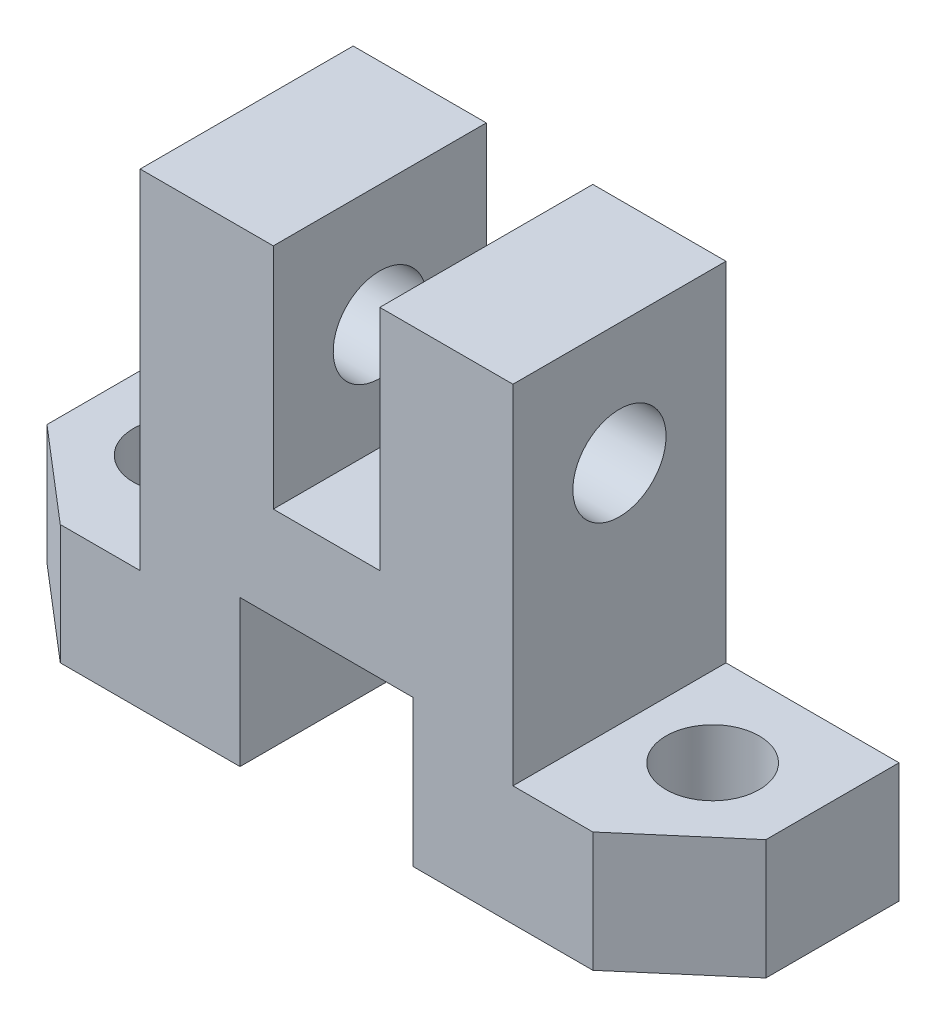
ISO-10303-21;
HEADER;
FILE_DESCRIPTION(('STEP AP214'),'2;1');
FILE_NAME('part.step','',(''),(''),'','','');
FILE_SCHEMA(('AUTOMOTIVE_DESIGN { 1 0 10303 214 1 1 1 1 }'));
ENDSEC;
DATA;
#1=APPLICATION_CONTEXT('core data for automotive mechanical design processes');
#2=APPLICATION_PROTOCOL_DEFINITION('international standard','automotive_design',2000,#1);
#3=PRODUCT_CONTEXT('',#1,'mechanical');
#4=PRODUCT('Part','Part','',(#3));
#5=PRODUCT_RELATED_PRODUCT_CATEGORY('part','',(#4));
#6=PRODUCT_DEFINITION_FORMATION('','',#4);
#7=PRODUCT_DEFINITION_CONTEXT('part definition',#1,'design');
#8=PRODUCT_DEFINITION('design','',#6,#7);
#9=PRODUCT_DEFINITION_SHAPE('','',#8);
#10=(LENGTH_UNIT() NAMED_UNIT(*) SI_UNIT(.MILLI.,.METRE.));
#11=(NAMED_UNIT(*) PLANE_ANGLE_UNIT() SI_UNIT($,.RADIAN.));
#12=(NAMED_UNIT(*) SI_UNIT($,.STERADIAN.) SOLID_ANGLE_UNIT());
#13=UNCERTAINTY_MEASURE_WITH_UNIT(LENGTH_MEASURE(1.E-05),#10,'distance_accuracy_value','');
#14=(GEOMETRIC_REPRESENTATION_CONTEXT(3) GLOBAL_UNCERTAINTY_ASSIGNED_CONTEXT((#13)) GLOBAL_UNIT_ASSIGNED_CONTEXT((#10,
#11,#12)) REPRESENTATION_CONTEXT('',''));
#15=CARTESIAN_POINT('',(0.,0.,0.));
#16=DIRECTION('',(0.,0.,1.));
#17=DIRECTION('',(1.,0.,0.));
#18=AXIS2_PLACEMENT_3D('',#15,#16,#17);
#19=CARTESIAN_POINT('',(0.,9.,0.));
#20=DIRECTION('',(0.,1.,0.));
#21=DIRECTION('',(0.,0.,1.));
#22=AXIS2_PLACEMENT_3D('',#19,#20,#21);
#23=PLANE('',#22);
#24=DIRECTION('',(0.,0.,1.));
#25=VECTOR('',#24,1.);
#26=CARTESIAN_POINT('',(-14.,9.,-7.));
#27=LINE('',#26,#25);
#28=CARTESIAN_POINT('',(-14.,9.,-7.));
#29=VERTEX_POINT('',#28);
#30=CARTESIAN_POINT('',(-14.,9.,9.));
#31=VERTEX_POINT('',#30);
#32=EDGE_CURVE('E61',#29,#31,#27,.T.);
#33=ORIENTED_EDGE('',*,*,#32,.F.);
#34=DIRECTION('',(-1.,0.,0.));
#35=VECTOR('',#34,1.);
#36=CARTESIAN_POINT('',(-6.5,9.,-7.));
#37=LINE('',#36,#35);
#38=CARTESIAN_POINT('',(-27.,9.,-7.));
#39=VERTEX_POINT('',#38);
#40=EDGE_CURVE('E331',#29,#39,#37,.T.);
#41=ORIENTED_EDGE('',*,*,#40,.T.);
#42=DIRECTION('',(0.,0.,1.));
#43=VECTOR('',#42,1.);
#44=CARTESIAN_POINT('',(-27.,9.,-7.));
#45=LINE('',#44,#43);
#46=CARTESIAN_POINT('',(-27.,9.,3.));
#47=VERTEX_POINT('',#46);
#48=EDGE_CURVE('E334',#39,#47,#45,.T.);
#49=ORIENTED_EDGE('',*,*,#48,.T.);
#50=DIRECTION('',(0.759256602365297,0.,0.650791373455968));
#51=VECTOR('',#50,1.);
#52=CARTESIAN_POINT('',(-27.,9.,3.));
#53=LINE('',#52,#51);
#54=CARTESIAN_POINT('',(-20.,9.,9.));
#55=VERTEX_POINT('',#54);
#56=EDGE_CURVE('E338',#47,#55,#53,.T.);
#57=ORIENTED_EDGE('',*,*,#56,.T.);
#58=DIRECTION('',(1.,0.,0.));
#59=VECTOR('',#58,1.);
#60=CARTESIAN_POINT('',(-20.,9.,9.));
#61=LINE('',#60,#59);
#62=EDGE_CURVE('E66',#55,#31,#61,.T.);
#63=ORIENTED_EDGE('',*,*,#62,.T.);
#64=EDGE_LOOP('',(#33,#41,#49,#57,#63));
#65=FACE_BOUND('',#64,.T.);
#66=CARTESIAN_POINT('',(-20.,9.,0.));
#67=DIRECTION('',(0.,1.,0.));
#68=DIRECTION('',(0.,0.,1.));
#69=AXIS2_PLACEMENT_3D('',#66,#67,#68);
#70=CIRCLE('',#69,3.5);
#71=CARTESIAN_POINT('',(-20.,9.,3.5));
#72=VERTEX_POINT('',#71);
#73=EDGE_CURVE('E323',#72,#72,#70,.T.);
#74=ORIENTED_EDGE('',*,*,#73,.F.);
#75=EDGE_LOOP('',(#74));
#76=FACE_BOUND('',#75,.T.);
#77=ADVANCED_FACE('F45',(#65,#76),#23,.T.);
#78=CARTESIAN_POINT('',(0.,0.,0.));
#79=DIRECTION('',(0.,1.,0.));
#80=DIRECTION('',(0.,0.,1.));
#81=AXIS2_PLACEMENT_3D('',#78,#79,#80);
#82=PLANE('',#81);
#83=DIRECTION('',(-1.,0.,0.));
#84=VECTOR('',#83,1.);
#85=CARTESIAN_POINT('',(-6.5,0.,-7.));
#86=LINE('',#85,#84);
#87=CARTESIAN_POINT('',(-6.5,0.,-7.));
#88=VERTEX_POINT('',#87);
#89=CARTESIAN_POINT('',(-27.,0.,-7.));
#90=VERTEX_POINT('',#89);
#91=EDGE_CURVE('E327',#88,#90,#86,.T.);
#92=ORIENTED_EDGE('',*,*,#91,.F.);
#93=DIRECTION('',(0.,0.,-1.));
#94=VECTOR('',#93,1.);
#95=CARTESIAN_POINT('',(-6.5,0.,9.));
#96=LINE('',#95,#94);
#97=CARTESIAN_POINT('',(-6.5,0.,9.));
#98=VERTEX_POINT('',#97);
#99=EDGE_CURVE('E335',#98,#88,#96,.T.);
#100=ORIENTED_EDGE('',*,*,#99,.F.);
#101=DIRECTION('',(1.,0.,0.));
#102=VECTOR('',#101,1.);
#103=CARTESIAN_POINT('',(-20.,0.,9.));
#104=LINE('',#103,#102);
#105=CARTESIAN_POINT('',(-20.,0.,9.));
#106=VERTEX_POINT('',#105);
#107=EDGE_CURVE('E352',#106,#98,#104,.T.);
#108=ORIENTED_EDGE('',*,*,#107,.F.);
#109=DIRECTION('',(0.759256602365297,0.,0.650791373455968));
#110=VECTOR('',#109,1.);
#111=CARTESIAN_POINT('',(-27.,0.,3.));
#112=LINE('',#111,#110);
#113=CARTESIAN_POINT('',(-27.,0.,3.));
#114=VERTEX_POINT('',#113);
#115=EDGE_CURVE('E349',#114,#106,#112,.T.);
#116=ORIENTED_EDGE('',*,*,#115,.F.);
#117=DIRECTION('',(0.,0.,1.));
#118=VECTOR('',#117,1.);
#119=CARTESIAN_POINT('',(-27.,0.,-7.));
#120=LINE('',#119,#118);
#121=EDGE_CURVE('E346',#90,#114,#120,.T.);
#122=ORIENTED_EDGE('',*,*,#121,.F.);
#123=EDGE_LOOP('',(#92,#100,#108,#116,#122));
#124=FACE_BOUND('',#123,.T.);
#125=CARTESIAN_POINT('',(-20.,0.,0.));
#126=DIRECTION('',(0.,1.,0.));
#127=DIRECTION('',(0.,0.,1.));
#128=AXIS2_PLACEMENT_3D('',#125,#126,#127);
#129=CIRCLE('',#128,3.5);
#130=CARTESIAN_POINT('',(-20.,0.,3.5));
#131=VERTEX_POINT('',#130);
#132=EDGE_CURVE('E295',#131,#131,#129,.T.);
#133=ORIENTED_EDGE('',*,*,#132,.T.);
#134=EDGE_LOOP('',(#133));
#135=FACE_BOUND('',#134,.T.);
#136=ADVANCED_FACE('F380',(#124,#135),#82,.F.);
#137=CARTESIAN_POINT('',(-6.5,9.,-7.));
#138=DIRECTION('',(0.,0.,1.));
#139=DIRECTION('',(1.,0.,0.));
#140=AXIS2_PLACEMENT_3D('',#137,#138,#139);
#141=PLANE('',#140);
#142=ORIENTED_EDGE('',*,*,#91,.T.);
#143=DIRECTION('',(0.,-1.,0.));
#144=VECTOR('',#143,1.);
#145=CARTESIAN_POINT('',(-27.,9.,-7.));
#146=LINE('',#145,#144);
#147=EDGE_CURVE('E11',#39,#90,#146,.T.);
#148=ORIENTED_EDGE('',*,*,#147,.F.);
#149=ORIENTED_EDGE('',*,*,#40,.F.);
#150=DIRECTION('',(0.,-1.,0.));
#151=VECTOR('',#150,1.);
#152=CARTESIAN_POINT('',(-14.,9.,-7.));
#153=LINE('',#152,#151);
#154=CARTESIAN_POINT('',(-14.,35.1241010050401,-7.));
#155=VERTEX_POINT('',#154);
#156=EDGE_CURVE('E254',#155,#29,#153,.T.);
#157=ORIENTED_EDGE('',*,*,#156,.F.);
#158=DIRECTION('',(-1.,0.,0.));
#159=VECTOR('',#158,1.);
#160=CARTESIAN_POINT('',(-14.,35.1241010050401,-7.));
#161=LINE('',#160,#159);
#162=CARTESIAN_POINT('',(-4.00000000000002,35.1241010050401,-7.));
#163=VERTEX_POINT('',#162);
#164=EDGE_CURVE('E250',#163,#155,#161,.T.);
#165=ORIENTED_EDGE('',*,*,#164,.F.);
#166=DIRECTION('',(0.,1.,0.));
#167=VECTOR('',#166,1.);
#168=CARTESIAN_POINT('',(-4.00000000000002,35.1241010050401,-7.));
#169=LINE('',#168,#167);
#170=CARTESIAN_POINT('',(-4.00000000000001,18.,-7.));
#171=VERTEX_POINT('',#170);
#172=EDGE_CURVE('E246',#171,#163,#169,.T.);
#173=ORIENTED_EDGE('',*,*,#172,.F.);
#174=DIRECTION('',(-1.,0.,0.));
#175=VECTOR('',#174,1.);
#176=CARTESIAN_POINT('',(4.,18.,-7.));
#177=LINE('',#176,#175);
#178=CARTESIAN_POINT('',(4.,18.,-7.));
#179=VERTEX_POINT('',#178);
#180=EDGE_CURVE('E242',#179,#171,#177,.T.);
#181=ORIENTED_EDGE('',*,*,#180,.F.);
#182=DIRECTION('',(0.,-1.,0.));
#183=VECTOR('',#182,1.);
#184=CARTESIAN_POINT('',(4.,35.1241010050401,-7.));
#185=LINE('',#184,#183);
#186=CARTESIAN_POINT('',(4.,35.1241010050401,-7.));
#187=VERTEX_POINT('',#186);
#188=EDGE_CURVE('E238',#187,#179,#185,.T.);
#189=ORIENTED_EDGE('',*,*,#188,.F.);
#190=DIRECTION('',(-1.,0.,0.));
#191=VECTOR('',#190,1.);
#192=CARTESIAN_POINT('',(14.,35.1241010050401,-7.));
#193=LINE('',#192,#191);
#194=CARTESIAN_POINT('',(14.,35.1241010050401,-7.));
#195=VERTEX_POINT('',#194);
#196=EDGE_CURVE('E233',#195,#187,#193,.T.);
#197=ORIENTED_EDGE('',*,*,#196,.F.);
#198=DIRECTION('',(0.,1.,0.));
#199=VECTOR('',#198,1.);
#200=CARTESIAN_POINT('',(14.,9.,-7.));
#201=LINE('',#200,#199);
#202=CARTESIAN_POINT('',(14.,9.,-7.));
#203=VERTEX_POINT('',#202);
#204=EDGE_CURVE('E229',#203,#195,#201,.T.);
#205=ORIENTED_EDGE('',*,*,#204,.F.);
#206=DIRECTION('',(-1.,0.,0.));
#207=VECTOR('',#206,1.);
#208=CARTESIAN_POINT('',(6.5,9.,-7.));
#209=LINE('',#208,#207);
#210=CARTESIAN_POINT('',(27.,9.,-7.));
#211=VERTEX_POINT('',#210);
#212=EDGE_CURVE('E213',#211,#203,#209,.T.);
#213=ORIENTED_EDGE('',*,*,#212,.F.);
#214=DIRECTION('',(0.,-1.,0.));
#215=VECTOR('',#214,1.);
#216=CARTESIAN_POINT('',(27.,9.,-7.));
#217=LINE('',#216,#215);
#218=CARTESIAN_POINT('',(27.,0.,-7.));
#219=VERTEX_POINT('',#218);
#220=EDGE_CURVE('E189',#211,#219,#217,.T.);
#221=ORIENTED_EDGE('',*,*,#220,.T.);
#222=DIRECTION('',(-1.,0.,0.));
#223=VECTOR('',#222,1.);
#224=CARTESIAN_POINT('',(6.5,0.,-7.));
#225=LINE('',#224,#223);
#226=CARTESIAN_POINT('',(6.5,0.,-7.));
#227=VERTEX_POINT('',#226);
#228=EDGE_CURVE('E185',#219,#227,#225,.T.);
#229=ORIENTED_EDGE('',*,*,#228,.T.);
#230=DIRECTION('',(0.,-1.,0.));
#231=VECTOR('',#230,1.);
#232=CARTESIAN_POINT('',(6.5,9.,-7.));
#233=LINE('',#232,#231);
#234=CARTESIAN_POINT('',(6.5,11.,-7.));
#235=VERTEX_POINT('',#234);
#236=EDGE_CURVE('E169',#235,#227,#233,.T.);
#237=ORIENTED_EDGE('',*,*,#236,.F.);
#238=DIRECTION('',(1.,0.,0.));
#239=VECTOR('',#238,1.);
#240=CARTESIAN_POINT('',(6.5,11.,-7.));
#241=LINE('',#240,#239);
#242=CARTESIAN_POINT('',(-6.50000000000001,11.,-7.));
#243=VERTEX_POINT('',#242);
#244=EDGE_CURVE('E181',#243,#235,#241,.T.);
#245=ORIENTED_EDGE('',*,*,#244,.F.);
#246=DIRECTION('',(0.,-1.,0.));
#247=VECTOR('',#246,1.);
#248=CARTESIAN_POINT('',(-6.5,9.,-7.));
#249=LINE('',#248,#247);
#250=EDGE_CURVE('E343',#243,#88,#249,.T.);
#251=ORIENTED_EDGE('',*,*,#250,.T.);
#252=EDGE_LOOP('',(#142,#148,#149,#157,#165,#173,#181,#189,#197,#205,#213,#221,#229,#237,#245,#251));
#253=FACE_BOUND('',#252,.T.);
#254=ADVANCED_FACE('F47',(#253),#141,.F.);
#255=CARTESIAN_POINT('',(-27.,9.,-7.));
#256=DIRECTION('',(1.,0.,0.));
#257=DIRECTION('',(0.,0.,-1.));
#258=AXIS2_PLACEMENT_3D('',#255,#256,#257);
#259=PLANE('',#258);
#260=ORIENTED_EDGE('',*,*,#121,.T.);
#261=DIRECTION('',(0.,-1.,0.));
#262=VECTOR('',#261,1.);
#263=CARTESIAN_POINT('',(-27.,9.,3.));
#264=LINE('',#263,#262);
#265=EDGE_CURVE('E54',#47,#114,#264,.T.);
#266=ORIENTED_EDGE('',*,*,#265,.F.);
#267=ORIENTED_EDGE('',*,*,#48,.F.);
#268=ORIENTED_EDGE('',*,*,#147,.T.);
#269=EDGE_LOOP('',(#260,#266,#267,#268));
#270=FACE_BOUND('',#269,.T.);
#271=ADVANCED_FACE('F460',(#270),#259,.F.);
#272=CARTESIAN_POINT('',(-27.,9.,3.));
#273=DIRECTION('',(0.650791373455968,0.,-0.759256602365297));
#274=DIRECTION('',(-0.759256602365297,0.,-0.650791373455968));
#275=AXIS2_PLACEMENT_3D('',#272,#273,#274);
#276=PLANE('',#275);
#277=ORIENTED_EDGE('',*,*,#115,.T.);
#278=DIRECTION('',(0.,-1.,0.));
#279=VECTOR('',#278,1.);
#280=CARTESIAN_POINT('',(-20.,9.,9.));
#281=LINE('',#280,#279);
#282=EDGE_CURVE('E364',#55,#106,#281,.T.);
#283=ORIENTED_EDGE('',*,*,#282,.F.);
#284=ORIENTED_EDGE('',*,*,#56,.F.);
#285=ORIENTED_EDGE('',*,*,#265,.T.);
#286=EDGE_LOOP('',(#277,#283,#284,#285));
#287=FACE_BOUND('',#286,.T.);
#288=ADVANCED_FACE('F373',(#287),#276,.F.);
#289=CARTESIAN_POINT('',(-20.,9.,9.));
#290=DIRECTION('',(0.,0.,-1.));
#291=DIRECTION('',(-1.,0.,0.));
#292=AXIS2_PLACEMENT_3D('',#289,#290,#291);
#293=PLANE('',#292);
#294=ORIENTED_EDGE('',*,*,#107,.T.);
#295=DIRECTION('',(0.,-1.,0.));
#296=VECTOR('',#295,1.);
#297=CARTESIAN_POINT('',(-6.5,9.,9.));
#298=LINE('',#297,#296);
#299=CARTESIAN_POINT('',(-6.50000000000001,11.,9.));
#300=VERTEX_POINT('',#299);
#301=EDGE_CURVE('E360',#300,#98,#298,.T.);
#302=ORIENTED_EDGE('',*,*,#301,.F.);
#303=DIRECTION('',(1.,0.,0.));
#304=VECTOR('',#303,1.);
#305=CARTESIAN_POINT('',(6.5,11.,9.));
#306=LINE('',#305,#304);
#307=CARTESIAN_POINT('',(6.5,11.,9.));
#308=VERTEX_POINT('',#307);
#309=EDGE_CURVE('E287',#300,#308,#306,.T.);
#310=ORIENTED_EDGE('',*,*,#309,.T.);
#311=DIRECTION('',(0.,-1.,0.));
#312=VECTOR('',#311,1.);
#313=CARTESIAN_POINT('',(6.5,9.,9.));
#314=LINE('',#313,#312);
#315=CARTESIAN_POINT('',(6.5,0.,9.));
#316=VERTEX_POINT('',#315);
#317=EDGE_CURVE('E234',#308,#316,#314,.T.);
#318=ORIENTED_EDGE('',*,*,#317,.T.);
#319=DIRECTION('',(1.,0.,0.));
#320=VECTOR('',#319,1.);
#321=CARTESIAN_POINT('',(20.,0.,9.));
#322=LINE('',#321,#320);
#323=CARTESIAN_POINT('',(20.,0.,9.));
#324=VERTEX_POINT('',#323);
#325=EDGE_CURVE('E200',#316,#324,#322,.T.);
#326=ORIENTED_EDGE('',*,*,#325,.T.);
#327=DIRECTION('',(0.,-1.,0.));
#328=VECTOR('',#327,1.);
#329=CARTESIAN_POINT('',(20.,9.,9.));
#330=LINE('',#329,#328);
#331=CARTESIAN_POINT('',(20.,9.,9.));
#332=VERTEX_POINT('',#331);
#333=EDGE_CURVE('E394',#332,#324,#330,.T.);
#334=ORIENTED_EDGE('',*,*,#333,.F.);
#335=DIRECTION('',(1.,0.,0.));
#336=VECTOR('',#335,1.);
#337=CARTESIAN_POINT('',(20.,9.,9.));
#338=LINE('',#337,#336);
#339=CARTESIAN_POINT('',(14.,9.,9.));
#340=VERTEX_POINT('',#339);
#341=EDGE_CURVE('E194',#340,#332,#338,.T.);
#342=ORIENTED_EDGE('',*,*,#341,.F.);
#343=DIRECTION('',(0.,1.,0.));
#344=VECTOR('',#343,1.);
#345=CARTESIAN_POINT('',(14.,9.,9.));
#346=LINE('',#345,#344);
#347=CARTESIAN_POINT('',(14.,35.1241010050401,9.));
#348=VERTEX_POINT('',#347);
#349=EDGE_CURVE('E227',#340,#348,#346,.T.);
#350=ORIENTED_EDGE('',*,*,#349,.T.);
#351=DIRECTION('',(-1.,0.,0.));
#352=VECTOR('',#351,1.);
#353=CARTESIAN_POINT('',(14.,35.1241010050401,9.));
#354=LINE('',#353,#352);
#355=CARTESIAN_POINT('',(4.,35.1241010050401,9.));
#356=VERTEX_POINT('',#355);
#357=EDGE_CURVE('E263',#348,#356,#354,.T.);
#358=ORIENTED_EDGE('',*,*,#357,.T.);
#359=DIRECTION('',(0.,-1.,0.));
#360=VECTOR('',#359,1.);
#361=CARTESIAN_POINT('',(4.,35.1241010050401,9.));
#362=LINE('',#361,#360);
#363=CARTESIAN_POINT('',(4.,18.,9.));
#364=VERTEX_POINT('',#363);
#365=EDGE_CURVE('E267',#356,#364,#362,.T.);
#366=ORIENTED_EDGE('',*,*,#365,.T.);
#367=DIRECTION('',(-1.,0.,0.));
#368=VECTOR('',#367,1.);
#369=CARTESIAN_POINT('',(4.,18.,9.));
#370=LINE('',#369,#368);
#371=CARTESIAN_POINT('',(-4.00000000000001,18.,9.));
#372=VERTEX_POINT('',#371);
#373=EDGE_CURVE('E271',#364,#372,#370,.T.);
#374=ORIENTED_EDGE('',*,*,#373,.T.);
#375=DIRECTION('',(0.,1.,0.));
#376=VECTOR('',#375,1.);
#377=CARTESIAN_POINT('',(-4.00000000000002,35.1241010050401,9.));
#378=LINE('',#377,#376);
#379=CARTESIAN_POINT('',(-4.00000000000002,35.1241010050401,9.));
#380=VERTEX_POINT('',#379);
#381=EDGE_CURVE('E275',#372,#380,#378,.T.);
#382=ORIENTED_EDGE('',*,*,#381,.T.);
#383=DIRECTION('',(-1.,0.,0.));
#384=VECTOR('',#383,1.);
#385=CARTESIAN_POINT('',(-14.,35.1241010050401,9.));
#386=LINE('',#385,#384);
#387=CARTESIAN_POINT('',(-14.,35.1241010050401,9.));
#388=VERTEX_POINT('',#387);
#389=EDGE_CURVE('E279',#380,#388,#386,.T.);
#390=ORIENTED_EDGE('',*,*,#389,.T.);
#391=DIRECTION('',(0.,-1.,0.));
#392=VECTOR('',#391,1.);
#393=CARTESIAN_POINT('',(-14.,9.,9.));
#394=LINE('',#393,#392);
#395=EDGE_CURVE('E283',#388,#31,#394,.T.);
#396=ORIENTED_EDGE('',*,*,#395,.T.);
#397=ORIENTED_EDGE('',*,*,#62,.F.);
#398=ORIENTED_EDGE('',*,*,#282,.T.);
#399=EDGE_LOOP('',(#294,#302,#310,#318,#326,#334,#342,#350,#358,#366,#374,#382,#390,#396,#397,#398));
#400=FACE_BOUND('',#399,.T.);
#401=ADVANCED_FACE('F384',(#400),#293,.F.);
#402=CARTESIAN_POINT('',(-6.5,9.,9.));
#403=DIRECTION('',(-1.,0.,0.));
#404=DIRECTION('',(0.,0.,1.));
#405=AXIS2_PLACEMENT_3D('',#402,#403,#404);
#406=PLANE('',#405);
#407=ORIENTED_EDGE('',*,*,#99,.T.);
#408=ORIENTED_EDGE('',*,*,#250,.F.);
#409=DIRECTION('',(0.,0.,1.));
#410=VECTOR('',#409,1.);
#411=CARTESIAN_POINT('',(-6.50000000000001,11.,-7.));
#412=LINE('',#411,#410);
#413=EDGE_CURVE('E296',#243,#300,#412,.T.);
#414=ORIENTED_EDGE('',*,*,#413,.T.);
#415=ORIENTED_EDGE('',*,*,#301,.T.);
#416=EDGE_LOOP('',(#407,#408,#414,#415));
#417=FACE_BOUND('',#416,.T.);
#418=ADVANCED_FACE('F386',(#417),#406,.F.);
#419=CARTESIAN_POINT('',(-20.,9.,0.));
#420=DIRECTION('',(0.,-1.,0.));
#421=DIRECTION('',(0.,0.,-1.));
#422=AXIS2_PLACEMENT_3D('',#419,#420,#421);
#423=CYLINDRICAL_SURFACE('',#422,3.5);
#424=ORIENTED_EDGE('',*,*,#73,.T.);
#425=EDGE_LOOP('',(#424));
#426=FACE_BOUND('',#425,.T.);
#427=ORIENTED_EDGE('',*,*,#132,.F.);
#428=EDGE_LOOP('',(#427));
#429=FACE_BOUND('',#428,.T.);
#430=ADVANCED_FACE('F452',(#426,#429),#423,.F.);
#431=CARTESIAN_POINT('',(6.5,9.,-7.));
#432=DIRECTION('',(-1.,0.,0.));
#433=DIRECTION('',(0.,0.,1.));
#434=AXIS2_PLACEMENT_3D('',#431,#432,#433);
#435=PLANE('',#434);
#436=ORIENTED_EDGE('',*,*,#317,.F.);
#437=DIRECTION('',(0.,0.,1.));
#438=VECTOR('',#437,1.);
#439=CARTESIAN_POINT('',(6.5,11.,-7.));
#440=LINE('',#439,#438);
#441=EDGE_CURVE('E175',#235,#308,#440,.T.);
#442=ORIENTED_EDGE('',*,*,#441,.F.);
#443=ORIENTED_EDGE('',*,*,#236,.T.);
#444=DIRECTION('',(0.,0.,1.));
#445=VECTOR('',#444,1.);
#446=CARTESIAN_POINT('',(6.5,0.,9.));
#447=LINE('',#446,#445);
#448=EDGE_CURVE('E174',#227,#316,#447,.T.);
#449=ORIENTED_EDGE('',*,*,#448,.T.);
#450=EDGE_LOOP('',(#436,#442,#443,#449));
#451=FACE_BOUND('',#450,.T.);
#452=ADVANCED_FACE('F172',(#451),#435,.T.);
#453=CARTESIAN_POINT('',(6.5,11.,-7.));
#454=DIRECTION('',(0.,-1.,0.));
#455=DIRECTION('',(0.,0.,-1.));
#456=AXIS2_PLACEMENT_3D('',#453,#454,#455);
#457=PLANE('',#456);
#458=ORIENTED_EDGE('',*,*,#309,.F.);
#459=ORIENTED_EDGE('',*,*,#413,.F.);
#460=ORIENTED_EDGE('',*,*,#244,.T.);
#461=ORIENTED_EDGE('',*,*,#441,.T.);
#462=EDGE_LOOP('',(#458,#459,#460,#461));
#463=FACE_BOUND('',#462,.T.);
#464=ADVANCED_FACE('F390',(#463),#457,.T.);
#465=CARTESIAN_POINT('',(-14.,9.,-7.));
#466=DIRECTION('',(-1.,0.,0.));
#467=DIRECTION('',(0.,-1.,0.));
#468=AXIS2_PLACEMENT_3D('',#465,#466,#467);
#469=PLANE('',#468);
#470=CARTESIAN_POINT('',(-14.,26.,0.999999999999997));
#471=DIRECTION('',(1.,0.,0.));
#472=DIRECTION('',(0.,0.,-1.));
#473=AXIS2_PLACEMENT_3D('',#470,#471,#472);
#474=CIRCLE('',#473,3.5);
#475=CARTESIAN_POINT('',(-14.,26.,-2.5));
#476=VERTEX_POINT('',#475);
#477=EDGE_CURVE('E419',#476,#476,#474,.T.);
#478=ORIENTED_EDGE('',*,*,#477,.T.);
#479=EDGE_LOOP('',(#478));
#480=FACE_BOUND('',#479,.T.);
#481=ORIENTED_EDGE('',*,*,#395,.F.);
#482=DIRECTION('',(0.,0.,1.));
#483=VECTOR('',#482,1.);
#484=CARTESIAN_POINT('',(-14.,35.1241010050401,-7.));
#485=LINE('',#484,#483);
#486=EDGE_CURVE('E302',#155,#388,#485,.T.);
#487=ORIENTED_EDGE('',*,*,#486,.F.);
#488=ORIENTED_EDGE('',*,*,#156,.T.);
#489=ORIENTED_EDGE('',*,*,#32,.T.);
#490=EDGE_LOOP('',(#481,#487,#488,#489));
#491=FACE_BOUND('',#490,.T.);
#492=ADVANCED_FACE('F428',(#480,#491),#469,.T.);
#493=CARTESIAN_POINT('',(-14.,35.1241010050401,-7.));
#494=DIRECTION('',(0.,1.,0.));
#495=DIRECTION('',(-1.,0.,0.));
#496=AXIS2_PLACEMENT_3D('',#493,#494,#495);
#497=PLANE('',#496);
#498=ORIENTED_EDGE('',*,*,#389,.F.);
#499=DIRECTION('',(0.,0.,1.));
#500=VECTOR('',#499,1.);
#501=CARTESIAN_POINT('',(-4.00000000000002,35.1241010050401,-7.));
#502=LINE('',#501,#500);
#503=EDGE_CURVE('E305',#163,#380,#502,.T.);
#504=ORIENTED_EDGE('',*,*,#503,.F.);
#505=ORIENTED_EDGE('',*,*,#164,.T.);
#506=ORIENTED_EDGE('',*,*,#486,.T.);
#507=EDGE_LOOP('',(#498,#504,#505,#506));
#508=FACE_BOUND('',#507,.T.);
#509=ADVANCED_FACE('F470',(#508),#497,.T.);
#510=CARTESIAN_POINT('',(-4.00000000000002,35.1241010050401,-7.));
#511=DIRECTION('',(1.,0.,0.));
#512=DIRECTION('',(0.,1.,0.));
#513=AXIS2_PLACEMENT_3D('',#510,#511,#512);
#514=PLANE('',#513);
#515=CARTESIAN_POINT('',(-4.00000000000001,26.,0.999999999999997));
#516=DIRECTION('',(1.,0.,0.));
#517=DIRECTION('',(0.,1.,0.));
#518=AXIS2_PLACEMENT_3D('',#515,#516,#517);
#519=CIRCLE('',#518,3.5);
#520=CARTESIAN_POINT('',(-4.00000000000002,29.5,0.999999999999997));
#521=VERTEX_POINT('',#520);
#522=EDGE_CURVE('E402',#521,#521,#519,.T.);
#523=ORIENTED_EDGE('',*,*,#522,.F.);
#524=EDGE_LOOP('',(#523));
#525=FACE_BOUND('',#524,.T.);
#526=ORIENTED_EDGE('',*,*,#381,.F.);
#527=DIRECTION('',(0.,0.,1.));
#528=VECTOR('',#527,1.);
#529=CARTESIAN_POINT('',(-4.00000000000001,18.,-7.));
#530=LINE('',#529,#528);
#531=EDGE_CURVE('E308',#171,#372,#530,.T.);
#532=ORIENTED_EDGE('',*,*,#531,.F.);
#533=ORIENTED_EDGE('',*,*,#172,.T.);
#534=ORIENTED_EDGE('',*,*,#503,.T.);
#535=EDGE_LOOP('',(#526,#532,#533,#534));
#536=FACE_BOUND('',#535,.T.);
#537=ADVANCED_FACE('F475',(#525,#536),#514,.T.);
#538=CARTESIAN_POINT('',(4.,18.,-7.));
#539=DIRECTION('',(0.,1.,0.));
#540=DIRECTION('',(-1.,0.,0.));
#541=AXIS2_PLACEMENT_3D('',#538,#539,#540);
#542=PLANE('',#541);
#543=ORIENTED_EDGE('',*,*,#373,.F.);
#544=DIRECTION('',(0.,0.,1.));
#545=VECTOR('',#544,1.);
#546=CARTESIAN_POINT('',(4.,18.,-7.));
#547=LINE('',#546,#545);
#548=EDGE_CURVE('E311',#179,#364,#547,.T.);
#549=ORIENTED_EDGE('',*,*,#548,.F.);
#550=ORIENTED_EDGE('',*,*,#180,.T.);
#551=ORIENTED_EDGE('',*,*,#531,.T.);
#552=EDGE_LOOP('',(#543,#549,#550,#551));
#553=FACE_BOUND('',#552,.T.);
#554=ADVANCED_FACE('F478',(#553),#542,.T.);
#555=CARTESIAN_POINT('',(4.,35.1241010050401,-7.));
#556=DIRECTION('',(-1.,0.,0.));
#557=DIRECTION('',(0.,-1.,0.));
#558=AXIS2_PLACEMENT_3D('',#555,#556,#557);
#559=PLANE('',#558);
#560=CARTESIAN_POINT('',(4.,26.,0.999999999999997));
#561=DIRECTION('',(-1.,0.,0.));
#562=DIRECTION('',(0.,-1.,0.));
#563=AXIS2_PLACEMENT_3D('',#560,#561,#562);
#564=CIRCLE('',#563,3.5);
#565=CARTESIAN_POINT('',(4.,22.5,0.999999999999997));
#566=VERTEX_POINT('',#565);
#567=EDGE_CURVE('E415',#566,#566,#564,.T.);
#568=ORIENTED_EDGE('',*,*,#567,.F.);
#569=EDGE_LOOP('',(#568));
#570=FACE_BOUND('',#569,.T.);
#571=ORIENTED_EDGE('',*,*,#365,.F.);
#572=DIRECTION('',(0.,0.,1.));
#573=VECTOR('',#572,1.);
#574=CARTESIAN_POINT('',(4.,35.1241010050401,-7.));
#575=LINE('',#574,#573);
#576=EDGE_CURVE('E314',#187,#356,#575,.T.);
#577=ORIENTED_EDGE('',*,*,#576,.F.);
#578=ORIENTED_EDGE('',*,*,#188,.T.);
#579=ORIENTED_EDGE('',*,*,#548,.T.);
#580=EDGE_LOOP('',(#571,#577,#578,#579));
#581=FACE_BOUND('',#580,.T.);
#582=ADVANCED_FACE('F483',(#570,#581),#559,.T.);
#583=CARTESIAN_POINT('',(14.,35.1241010050401,-7.));
#584=DIRECTION('',(0.,1.,0.));
#585=DIRECTION('',(0.,0.,1.));
#586=AXIS2_PLACEMENT_3D('',#583,#584,#585);
#587=PLANE('',#586);
#588=ORIENTED_EDGE('',*,*,#357,.F.);
#589=DIRECTION('',(0.,0.,1.));
#590=VECTOR('',#589,1.);
#591=CARTESIAN_POINT('',(14.,35.1241010050401,-7.));
#592=LINE('',#591,#590);
#593=EDGE_CURVE('E317',#195,#348,#592,.T.);
#594=ORIENTED_EDGE('',*,*,#593,.F.);
#595=ORIENTED_EDGE('',*,*,#196,.T.);
#596=ORIENTED_EDGE('',*,*,#576,.T.);
#597=EDGE_LOOP('',(#588,#594,#595,#596));
#598=FACE_BOUND('',#597,.T.);
#599=ADVANCED_FACE('F486',(#598),#587,.T.);
#600=CARTESIAN_POINT('',(14.,9.,-7.));
#601=DIRECTION('',(1.,0.,0.));
#602=DIRECTION('',(0.,0.,-1.));
#603=AXIS2_PLACEMENT_3D('',#600,#601,#602);
#604=PLANE('',#603);
#605=CARTESIAN_POINT('',(14.,26.,0.999999999999997));
#606=DIRECTION('',(1.,0.,0.));
#607=DIRECTION('',(0.,0.,-1.));
#608=AXIS2_PLACEMENT_3D('',#605,#606,#607);
#609=CIRCLE('',#608,3.5);
#610=CARTESIAN_POINT('',(14.,26.,-2.5));
#611=VERTEX_POINT('',#610);
#612=EDGE_CURVE('E420',#611,#611,#609,.T.);
#613=ORIENTED_EDGE('',*,*,#612,.F.);
#614=EDGE_LOOP('',(#613));
#615=FACE_BOUND('',#614,.T.);
#616=ORIENTED_EDGE('',*,*,#349,.F.);
#617=DIRECTION('',(0.,0.,1.));
#618=VECTOR('',#617,1.);
#619=CARTESIAN_POINT('',(14.,9.,-7.));
#620=LINE('',#619,#618);
#621=EDGE_CURVE('E180',#203,#340,#620,.T.);
#622=ORIENTED_EDGE('',*,*,#621,.F.);
#623=ORIENTED_EDGE('',*,*,#204,.T.);
#624=ORIENTED_EDGE('',*,*,#593,.T.);
#625=EDGE_LOOP('',(#616,#622,#623,#624));
#626=FACE_BOUND('',#625,.T.);
#627=ADVANCED_FACE('F489',(#615,#626),#604,.T.);
#628=CARTESIAN_POINT('',(0.,9.,0.));
#629=DIRECTION('',(0.,-1.,0.));
#630=DIRECTION('',(0.,0.,-1.));
#631=AXIS2_PLACEMENT_3D('',#628,#629,#630);
#632=PLANE('',#631);
#633=ORIENTED_EDGE('',*,*,#621,.T.);
#634=ORIENTED_EDGE('',*,*,#341,.T.);
#635=DIRECTION('',(0.759256602365297,0.,-0.650791373455968));
#636=VECTOR('',#635,1.);
#637=CARTESIAN_POINT('',(27.,9.,3.));
#638=LINE('',#637,#636);
#639=CARTESIAN_POINT('',(27.,9.,3.));
#640=VERTEX_POINT('',#639);
#641=EDGE_CURVE('E220',#332,#640,#638,.T.);
#642=ORIENTED_EDGE('',*,*,#641,.T.);
#643=DIRECTION('',(0.,0.,-1.));
#644=VECTOR('',#643,1.);
#645=CARTESIAN_POINT('',(27.,9.,-7.));
#646=LINE('',#645,#644);
#647=EDGE_CURVE('E217',#640,#211,#646,.T.);
#648=ORIENTED_EDGE('',*,*,#647,.T.);
#649=ORIENTED_EDGE('',*,*,#212,.T.);
#650=EDGE_LOOP('',(#633,#634,#642,#648,#649));
#651=FACE_BOUND('',#650,.T.);
#652=CARTESIAN_POINT('',(20.,9.,0.));
#653=DIRECTION('',(0.,1.,0.));
#654=DIRECTION('',(0.,0.,-1.));
#655=AXIS2_PLACEMENT_3D('',#652,#653,#654);
#656=CIRCLE('',#655,3.5);
#657=CARTESIAN_POINT('',(20.,9.,-3.5));
#658=VERTEX_POINT('',#657);
#659=EDGE_CURVE('E202',#658,#658,#656,.T.);
#660=ORIENTED_EDGE('',*,*,#659,.F.);
#661=EDGE_LOOP('',(#660));
#662=FACE_BOUND('',#661,.T.);
#663=ADVANCED_FACE('F491',(#651,#662),#632,.F.);
#664=CARTESIAN_POINT('',(0.,0.,0.));
#665=DIRECTION('',(0.,-1.,0.));
#666=DIRECTION('',(0.,0.,-1.));
#667=AXIS2_PLACEMENT_3D('',#664,#665,#666);
#668=PLANE('',#667);
#669=ORIENTED_EDGE('',*,*,#448,.F.);
#670=ORIENTED_EDGE('',*,*,#228,.F.);
#671=DIRECTION('',(0.,0.,-1.));
#672=VECTOR('',#671,1.);
#673=CARTESIAN_POINT('',(27.,0.,-7.));
#674=LINE('',#673,#672);
#675=CARTESIAN_POINT('',(27.,0.,3.));
#676=VERTEX_POINT('',#675);
#677=EDGE_CURVE('E193',#676,#219,#674,.T.);
#678=ORIENTED_EDGE('',*,*,#677,.F.);
#679=DIRECTION('',(0.759256602365297,0.,-0.650791373455968));
#680=VECTOR('',#679,1.);
#681=CARTESIAN_POINT('',(27.,0.,3.));
#682=LINE('',#681,#680);
#683=EDGE_CURVE('E209',#324,#676,#682,.T.);
#684=ORIENTED_EDGE('',*,*,#683,.F.);
#685=ORIENTED_EDGE('',*,*,#325,.F.);
#686=EDGE_LOOP('',(#669,#670,#678,#684,#685));
#687=FACE_BOUND('',#686,.T.);
#688=CARTESIAN_POINT('',(20.,0.,0.));
#689=DIRECTION('',(0.,1.,0.));
#690=DIRECTION('',(0.,0.,-1.));
#691=AXIS2_PLACEMENT_3D('',#688,#689,#690);
#692=CIRCLE('',#691,3.5);
#693=CARTESIAN_POINT('',(20.,0.,-3.5));
#694=VERTEX_POINT('',#693);
#695=EDGE_CURVE('E207',#694,#694,#692,.T.);
#696=ORIENTED_EDGE('',*,*,#695,.T.);
#697=EDGE_LOOP('',(#696));
#698=FACE_BOUND('',#697,.T.);
#699=ADVANCED_FACE('F197',(#687,#698),#668,.T.);
#700=CARTESIAN_POINT('',(27.,9.,3.));
#701=DIRECTION('',(-0.650791373455968,0.,-0.759256602365297));
#702=DIRECTION('',(-0.759256602365297,0.,0.650791373455968));
#703=AXIS2_PLACEMENT_3D('',#700,#701,#702);
#704=PLANE('',#703);
#705=ORIENTED_EDGE('',*,*,#683,.T.);
#706=DIRECTION('',(0.,-1.,0.));
#707=VECTOR('',#706,1.);
#708=CARTESIAN_POINT('',(27.,9.,3.));
#709=LINE('',#708,#707);
#710=EDGE_CURVE('E401',#640,#676,#709,.T.);
#711=ORIENTED_EDGE('',*,*,#710,.F.);
#712=ORIENTED_EDGE('',*,*,#641,.F.);
#713=ORIENTED_EDGE('',*,*,#333,.T.);
#714=EDGE_LOOP('',(#705,#711,#712,#713));
#715=FACE_BOUND('',#714,.T.);
#716=ADVANCED_FACE('F397',(#715),#704,.F.);
#717=CARTESIAN_POINT('',(27.,9.,-7.));
#718=DIRECTION('',(-1.,0.,0.));
#719=DIRECTION('',(0.,0.,1.));
#720=AXIS2_PLACEMENT_3D('',#717,#718,#719);
#721=PLANE('',#720);
#722=ORIENTED_EDGE('',*,*,#677,.T.);
#723=ORIENTED_EDGE('',*,*,#220,.F.);
#724=ORIENTED_EDGE('',*,*,#647,.F.);
#725=ORIENTED_EDGE('',*,*,#710,.T.);
#726=EDGE_LOOP('',(#722,#723,#724,#725));
#727=FACE_BOUND('',#726,.T.);
#728=ADVANCED_FACE('F495',(#727),#721,.F.);
#729=CARTESIAN_POINT('',(20.,9.,0.));
#730=DIRECTION('',(0.,-1.,0.));
#731=DIRECTION('',(0.,0.,-1.));
#732=AXIS2_PLACEMENT_3D('',#729,#730,#731);
#733=CYLINDRICAL_SURFACE('',#732,3.5);
#734=ORIENTED_EDGE('',*,*,#659,.T.);
#735=EDGE_LOOP('',(#734));
#736=FACE_BOUND('',#735,.T.);
#737=ORIENTED_EDGE('',*,*,#695,.F.);
#738=EDGE_LOOP('',(#737));
#739=FACE_BOUND('',#738,.T.);
#740=ADVANCED_FACE('F439',(#736,#739),#733,.F.);
#741=CARTESIAN_POINT('',(-14.,26.,0.999999999999997));
#742=DIRECTION('',(1.,0.,0.));
#743=DIRECTION('',(0.,0.,-1.));
#744=AXIS2_PLACEMENT_3D('',#741,#742,#743);
#745=CYLINDRICAL_SURFACE('',#744,3.5);
#746=ORIENTED_EDGE('',*,*,#567,.T.);
#747=EDGE_LOOP('',(#746));
#748=FACE_BOUND('',#747,.T.);
#749=ORIENTED_EDGE('',*,*,#612,.T.);
#750=EDGE_LOOP('',(#749));
#751=FACE_BOUND('',#750,.T.);
#752=ADVANCED_FACE('F433',(#748,#751),#745,.F.);
#753=ORIENTED_EDGE('',*,*,#522,.T.);
#754=EDGE_LOOP('',(#753));
#755=FACE_BOUND('',#754,.T.);
#756=ORIENTED_EDGE('',*,*,#477,.F.);
#757=EDGE_LOOP('',(#756));
#758=FACE_BOUND('',#757,.T.);
#759=ADVANCED_FACE('F431',(#755,#758),#745,.F.);
#760=CLOSED_SHELL('',(#77,#136,#254,#271,#288,#401,#418,#430,#452,#464,#492,#509,#537,#554,#582,
#599,#627,#663,#699,#716,#728,#740,#752,#759));
#761=MANIFOLD_SOLID_BREP('B2',#760);
#762=ADVANCED_BREP_SHAPE_REPRESENTATION('',(#18,#761),#14);
#763=SHAPE_DEFINITION_REPRESENTATION(#9,#762);
ENDSEC;
END-ISO-10303-21;
